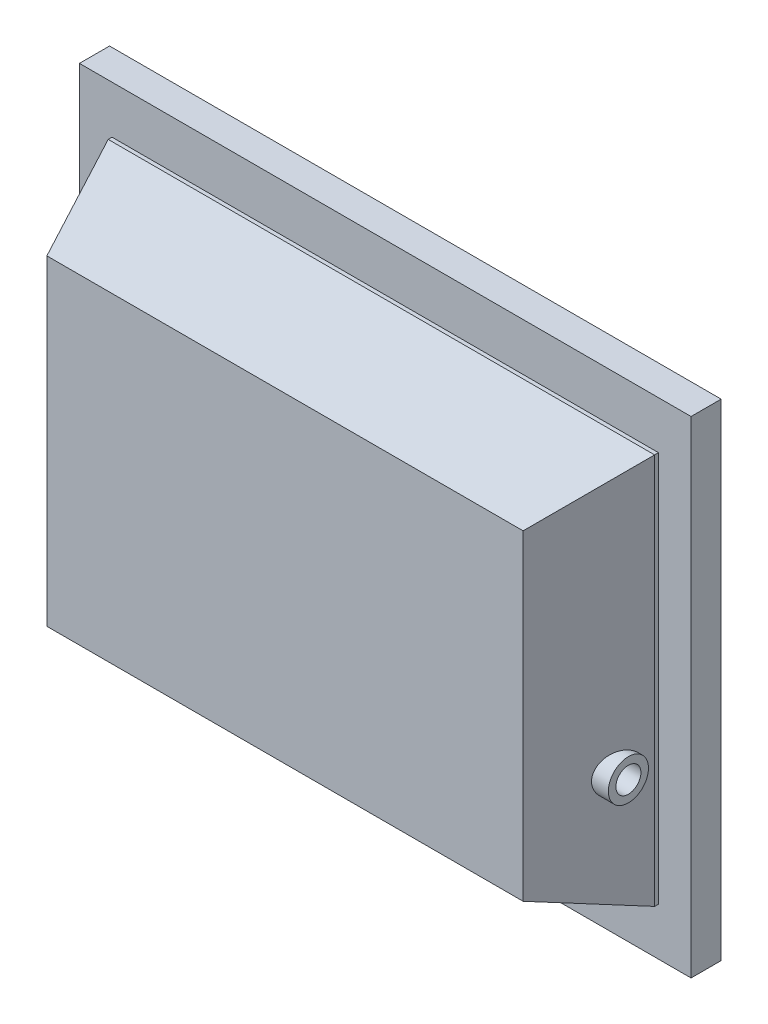
ISO-10303-21;
HEADER;
FILE_DESCRIPTION(('STEP AP214'),'2;1');
FILE_NAME('part.step','',(''),(''),'','','');
FILE_SCHEMA(('AUTOMOTIVE_DESIGN { 1 0 10303 214 1 1 1 1 }'));
ENDSEC;
DATA;
#1=APPLICATION_CONTEXT('core data for automotive mechanical design processes');
#2=APPLICATION_PROTOCOL_DEFINITION('international standard','automotive_design',2000,#1);
#3=PRODUCT_CONTEXT('',#1,'mechanical');
#4=PRODUCT('Part','Part','',(#3));
#5=PRODUCT_RELATED_PRODUCT_CATEGORY('part','',(#4));
#6=PRODUCT_DEFINITION_FORMATION('','',#4);
#7=PRODUCT_DEFINITION_CONTEXT('part definition',#1,'design');
#8=PRODUCT_DEFINITION('design','',#6,#7);
#9=PRODUCT_DEFINITION_SHAPE('','',#8);
#10=(LENGTH_UNIT() NAMED_UNIT(*) SI_UNIT(.MILLI.,.METRE.));
#11=(NAMED_UNIT(*) PLANE_ANGLE_UNIT() SI_UNIT($,.RADIAN.));
#12=(NAMED_UNIT(*) SI_UNIT($,.STERADIAN.) SOLID_ANGLE_UNIT());
#13=UNCERTAINTY_MEASURE_WITH_UNIT(LENGTH_MEASURE(1.E-05),#10,'distance_accuracy_value','');
#14=(GEOMETRIC_REPRESENTATION_CONTEXT(3) GLOBAL_UNCERTAINTY_ASSIGNED_CONTEXT((#13)) GLOBAL_UNIT_ASSIGNED_CONTEXT((#10,
#11,#12)) REPRESENTATION_CONTEXT('',''));
#15=CARTESIAN_POINT('',(0.,0.,0.));
#16=DIRECTION('',(0.,0.,1.));
#17=DIRECTION('',(1.,0.,0.));
#18=AXIS2_PLACEMENT_3D('',#15,#16,#17);
#19=CARTESIAN_POINT('',(0.,0.,6.));
#20=DIRECTION('',(0.,0.,-1.));
#21=DIRECTION('',(-1.,0.,0.));
#22=AXIS2_PLACEMENT_3D('',#19,#20,#21);
#23=PLANE('',#22);
#24=DIRECTION('',(0.,1.,0.));
#25=VECTOR('',#24,1.);
#26=CARTESIAN_POINT('',(61.,-48.5,6.));
#27=LINE('',#26,#25);
#28=CARTESIAN_POINT('',(61.,-48.5,6.));
#29=VERTEX_POINT('',#28);
#30=CARTESIAN_POINT('',(61.,48.5,6.));
#31=VERTEX_POINT('',#30);
#32=EDGE_CURVE('E229',#29,#31,#27,.T.);
#33=ORIENTED_EDGE('',*,*,#32,.T.);
#34=DIRECTION('',(-1.,0.,0.));
#35=VECTOR('',#34,1.);
#36=CARTESIAN_POINT('',(-61.,48.5,6.));
#37=LINE('',#36,#35);
#38=CARTESIAN_POINT('',(-61.,48.5,6.));
#39=VERTEX_POINT('',#38);
#40=EDGE_CURVE('E232',#31,#39,#37,.T.);
#41=ORIENTED_EDGE('',*,*,#40,.T.);
#42=DIRECTION('',(0.,-1.,0.));
#43=VECTOR('',#42,1.);
#44=CARTESIAN_POINT('',(-61.,-48.5,6.));
#45=LINE('',#44,#43);
#46=CARTESIAN_POINT('',(-61.,-48.5,6.));
#47=VERTEX_POINT('',#46);
#48=EDGE_CURVE('E235',#39,#47,#45,.T.);
#49=ORIENTED_EDGE('',*,*,#48,.T.);
#50=DIRECTION('',(1.,0.,0.));
#51=VECTOR('',#50,1.);
#52=CARTESIAN_POINT('',(-61.,-48.5,6.));
#53=LINE('',#52,#51);
#54=EDGE_CURVE('E237',#47,#29,#53,.T.);
#55=ORIENTED_EDGE('',*,*,#54,.T.);
#56=EDGE_LOOP('',(#33,#41,#49,#55));
#57=FACE_BOUND('',#56,.T.);
#58=DIRECTION('',(0.,1.,0.));
#59=VECTOR('',#58,1.);
#60=CARTESIAN_POINT('',(54.5,-39.,6.));
#61=LINE('',#60,#59);
#62=CARTESIAN_POINT('',(54.5,-39.,6.));
#63=VERTEX_POINT('',#62);
#64=CARTESIAN_POINT('',(54.5,39.,6.));
#65=VERTEX_POINT('',#64);
#66=EDGE_CURVE('E207',#63,#65,#61,.T.);
#67=ORIENTED_EDGE('',*,*,#66,.F.);
#68=DIRECTION('',(1.,0.,0.));
#69=VECTOR('',#68,1.);
#70=CARTESIAN_POINT('',(-54.5,-39.,6.));
#71=LINE('',#70,#69);
#72=CARTESIAN_POINT('',(-54.5,-39.,6.));
#73=VERTEX_POINT('',#72);
#74=EDGE_CURVE('E217',#73,#63,#71,.T.);
#75=ORIENTED_EDGE('',*,*,#74,.F.);
#76=DIRECTION('',(0.,-1.,0.));
#77=VECTOR('',#76,1.);
#78=CARTESIAN_POINT('',(-54.5,-39.,6.));
#79=LINE('',#78,#77);
#80=CARTESIAN_POINT('',(-54.5,39.,6.));
#81=VERTEX_POINT('',#80);
#82=EDGE_CURVE('E214',#81,#73,#79,.T.);
#83=ORIENTED_EDGE('',*,*,#82,.F.);
#84=DIRECTION('',(-1.,0.,0.));
#85=VECTOR('',#84,1.);
#86=CARTESIAN_POINT('',(-54.5,39.,6.));
#87=LINE('',#86,#85);
#88=EDGE_CURVE('E210',#65,#81,#87,.T.);
#89=ORIENTED_EDGE('',*,*,#88,.F.);
#90=EDGE_LOOP('',(#67,#75,#83,#89));
#91=FACE_BOUND('',#90,.T.);
#92=ADVANCED_FACE('F52',(#57,#91),#23,.F.);
#93=CARTESIAN_POINT('',(61.,-48.5,6.));
#94=DIRECTION('',(-1.,0.,0.));
#95=DIRECTION('',(0.,0.,1.));
#96=AXIS2_PLACEMENT_3D('',#93,#94,#95);
#97=PLANE('',#96);
#98=DIRECTION('',(0.,1.,0.));
#99=VECTOR('',#98,1.);
#100=CARTESIAN_POINT('',(61.,-48.5,0.));
#101=LINE('',#100,#99);
#102=CARTESIAN_POINT('',(61.,-48.5,0.));
#103=VERTEX_POINT('',#102);
#104=CARTESIAN_POINT('',(61.,48.5,0.));
#105=VERTEX_POINT('',#104);
#106=EDGE_CURVE('E228',#103,#105,#101,.T.);
#107=ORIENTED_EDGE('',*,*,#106,.T.);
#108=DIRECTION('',(0.,0.,-1.));
#109=VECTOR('',#108,1.);
#110=CARTESIAN_POINT('',(61.,48.5,6.));
#111=LINE('',#110,#109);
#112=EDGE_CURVE('E255',#31,#105,#111,.T.);
#113=ORIENTED_EDGE('',*,*,#112,.F.);
#114=ORIENTED_EDGE('',*,*,#32,.F.);
#115=DIRECTION('',(0.,0.,-1.));
#116=VECTOR('',#115,1.);
#117=CARTESIAN_POINT('',(61.,-48.5,6.));
#118=LINE('',#117,#116);
#119=EDGE_CURVE('E239',#29,#103,#118,.T.);
#120=ORIENTED_EDGE('',*,*,#119,.T.);
#121=EDGE_LOOP('',(#107,#113,#114,#120));
#122=FACE_BOUND('',#121,.T.);
#123=ADVANCED_FACE('F319',(#122),#97,.F.);
#124=CARTESIAN_POINT('',(-61.,48.5,6.));
#125=DIRECTION('',(0.,-1.,0.));
#126=DIRECTION('',(0.,0.,-1.));
#127=AXIS2_PLACEMENT_3D('',#124,#125,#126);
#128=PLANE('',#127);
#129=DIRECTION('',(-1.,0.,0.));
#130=VECTOR('',#129,1.);
#131=CARTESIAN_POINT('',(-61.,48.5,0.));
#132=LINE('',#131,#130);
#133=CARTESIAN_POINT('',(-61.,48.5,0.));
#134=VERTEX_POINT('',#133);
#135=EDGE_CURVE('E242',#105,#134,#132,.T.);
#136=ORIENTED_EDGE('',*,*,#135,.T.);
#137=DIRECTION('',(0.,0.,-1.));
#138=VECTOR('',#137,1.);
#139=CARTESIAN_POINT('',(-61.,48.5,6.));
#140=LINE('',#139,#138);
#141=EDGE_CURVE('E252',#39,#134,#140,.T.);
#142=ORIENTED_EDGE('',*,*,#141,.F.);
#143=ORIENTED_EDGE('',*,*,#40,.F.);
#144=ORIENTED_EDGE('',*,*,#112,.T.);
#145=EDGE_LOOP('',(#136,#142,#143,#144));
#146=FACE_BOUND('',#145,.T.);
#147=ADVANCED_FACE('F327',(#146),#128,.F.);
#148=CARTESIAN_POINT('',(-61.,-48.5,6.));
#149=DIRECTION('',(1.,0.,0.));
#150=DIRECTION('',(0.,0.,-1.));
#151=AXIS2_PLACEMENT_3D('',#148,#149,#150);
#152=PLANE('',#151);
#153=DIRECTION('',(0.,-1.,0.));
#154=VECTOR('',#153,1.);
#155=CARTESIAN_POINT('',(-61.,-48.5,0.));
#156=LINE('',#155,#154);
#157=CARTESIAN_POINT('',(-61.,-48.5,0.));
#158=VERTEX_POINT('',#157);
#159=EDGE_CURVE('E244',#134,#158,#156,.T.);
#160=ORIENTED_EDGE('',*,*,#159,.T.);
#161=DIRECTION('',(0.,0.,-1.));
#162=VECTOR('',#161,1.);
#163=CARTESIAN_POINT('',(-61.,-48.5,6.));
#164=LINE('',#163,#162);
#165=EDGE_CURVE('E249',#47,#158,#164,.T.);
#166=ORIENTED_EDGE('',*,*,#165,.F.);
#167=ORIENTED_EDGE('',*,*,#48,.F.);
#168=ORIENTED_EDGE('',*,*,#141,.T.);
#169=EDGE_LOOP('',(#160,#166,#167,#168));
#170=FACE_BOUND('',#169,.T.);
#171=ADVANCED_FACE('F341',(#170),#152,.F.);
#172=CARTESIAN_POINT('',(-61.,-48.5,6.));
#173=DIRECTION('',(0.,1.,0.));
#174=DIRECTION('',(0.,0.,1.));
#175=AXIS2_PLACEMENT_3D('',#172,#173,#174);
#176=PLANE('',#175);
#177=DIRECTION('',(1.,0.,0.));
#178=VECTOR('',#177,1.);
#179=CARTESIAN_POINT('',(-61.,-48.5,0.));
#180=LINE('',#179,#178);
#181=EDGE_CURVE('E233',#158,#103,#180,.T.);
#182=ORIENTED_EDGE('',*,*,#181,.T.);
#183=ORIENTED_EDGE('',*,*,#119,.F.);
#184=ORIENTED_EDGE('',*,*,#54,.F.);
#185=ORIENTED_EDGE('',*,*,#165,.T.);
#186=EDGE_LOOP('',(#182,#183,#184,#185));
#187=FACE_BOUND('',#186,.T.);
#188=ADVANCED_FACE('F338',(#187),#176,.F.);
#189=CARTESIAN_POINT('',(0.,0.,0.));
#190=DIRECTION('',(0.,0.,-1.));
#191=DIRECTION('',(-1.,0.,0.));
#192=AXIS2_PLACEMENT_3D('',#189,#190,#191);
#193=PLANE('',#192);
#194=DIRECTION('',(0.,-1.,0.));
#195=VECTOR('',#194,1.);
#196=CARTESIAN_POINT('',(46.2409304242549,34.6820960524735,0.));
#197=LINE('',#196,#195);
#198=CARTESIAN_POINT('',(46.2409304242549,34.6820960524735,0.));
#199=VERTEX_POINT('',#198);
#200=CARTESIAN_POINT('',(46.2409304242549,-34.6820960524735,0.));
#201=VERTEX_POINT('',#200);
#202=EDGE_CURVE('E69',#199,#201,#197,.T.);
#203=ORIENTED_EDGE('',*,*,#202,.F.);
#204=DIRECTION('',(1.,0.,0.));
#205=VECTOR('',#204,1.);
#206=CARTESIAN_POINT('',(-46.2409304242549,34.6820960524735,0.));
#207=LINE('',#206,#205);
#208=CARTESIAN_POINT('',(-46.2409304242549,34.6820960524735,0.));
#209=VERTEX_POINT('',#208);
#210=EDGE_CURVE('E176',#209,#199,#207,.T.);
#211=ORIENTED_EDGE('',*,*,#210,.F.);
#212=DIRECTION('',(0.,1.,0.));
#213=VECTOR('',#212,1.);
#214=CARTESIAN_POINT('',(-46.2409304242549,34.6820960524735,0.));
#215=LINE('',#214,#213);
#216=CARTESIAN_POINT('',(-46.2409304242549,-34.6820960524735,0.));
#217=VERTEX_POINT('',#216);
#218=EDGE_CURVE('E179',#217,#209,#215,.T.);
#219=ORIENTED_EDGE('',*,*,#218,.F.);
#220=DIRECTION('',(-1.,0.,0.));
#221=VECTOR('',#220,1.);
#222=CARTESIAN_POINT('',(-46.2409304242549,-34.6820960524735,0.));
#223=LINE('',#222,#221);
#224=EDGE_CURVE('E185',#201,#217,#223,.T.);
#225=ORIENTED_EDGE('',*,*,#224,.F.);
#226=EDGE_LOOP('',(#203,#211,#219,#225));
#227=FACE_BOUND('',#226,.T.);
#228=ORIENTED_EDGE('',*,*,#106,.F.);
#229=ORIENTED_EDGE('',*,*,#181,.F.);
#230=ORIENTED_EDGE('',*,*,#159,.F.);
#231=ORIENTED_EDGE('',*,*,#135,.F.);
#232=EDGE_LOOP('',(#228,#229,#230,#231));
#233=FACE_BOUND('',#232,.T.);
#234=ADVANCED_FACE('F335',(#227,#233),#193,.T.);
#235=CARTESIAN_POINT('',(54.5,-39.,26.));
#236=DIRECTION('',(-1.,0.,0.));
#237=DIRECTION('',(0.,0.,1.));
#238=AXIS2_PLACEMENT_3D('',#235,#236,#237);
#239=PLANE('',#238);
#240=DIRECTION('',(0.,0.,-1.));
#241=VECTOR('',#240,1.);
#242=CARTESIAN_POINT('',(54.5,39.,26.));
#243=LINE('',#242,#241);
#244=CARTESIAN_POINT('',(54.5,39.,6.76765806381766));
#245=VERTEX_POINT('',#244);
#246=EDGE_CURVE('E226',#245,#65,#243,.T.);
#247=ORIENTED_EDGE('',*,*,#246,.F.);
#248=DIRECTION('',(0.,-1.,0.));
#249=VECTOR('',#248,1.);
#250=CARTESIAN_POINT('',(54.5,-39.,6.76765806381766));
#251=LINE('',#250,#249);
#252=CARTESIAN_POINT('',(54.5,-39.,6.76765806381766));
#253=VERTEX_POINT('',#252);
#254=EDGE_CURVE('E270',#245,#253,#251,.T.);
#255=ORIENTED_EDGE('',*,*,#254,.T.);
#256=DIRECTION('',(0.,0.,-1.));
#257=VECTOR('',#256,1.);
#258=CARTESIAN_POINT('',(54.5,-39.,26.));
#259=LINE('',#258,#257);
#260=EDGE_CURVE('E220',#253,#63,#259,.T.);
#261=ORIENTED_EDGE('',*,*,#260,.T.);
#262=ORIENTED_EDGE('',*,*,#66,.T.);
#263=EDGE_LOOP('',(#247,#255,#261,#262));
#264=FACE_BOUND('',#263,.T.);
#265=ADVANCED_FACE('F333',(#264),#239,.F.);
#266=CARTESIAN_POINT('',(-54.5,39.,26.));
#267=DIRECTION('',(0.,-1.,0.));
#268=DIRECTION('',(0.,0.,-1.));
#269=AXIS2_PLACEMENT_3D('',#266,#267,#268);
#270=PLANE('',#269);
#271=DIRECTION('',(0.,0.,-1.));
#272=VECTOR('',#271,1.);
#273=CARTESIAN_POINT('',(-54.5,39.,26.));
#274=LINE('',#273,#272);
#275=CARTESIAN_POINT('',(-54.5,39.,6.76765806381766));
#276=VERTEX_POINT('',#275);
#277=EDGE_CURVE('E224',#276,#81,#274,.T.);
#278=ORIENTED_EDGE('',*,*,#277,.F.);
#279=DIRECTION('',(1.,0.,0.));
#280=VECTOR('',#279,1.);
#281=CARTESIAN_POINT('',(-54.5,39.,6.76765806381766));
#282=LINE('',#281,#280);
#283=EDGE_CURVE('E267',#276,#245,#282,.T.);
#284=ORIENTED_EDGE('',*,*,#283,.T.);
#285=ORIENTED_EDGE('',*,*,#246,.T.);
#286=ORIENTED_EDGE('',*,*,#88,.T.);
#287=EDGE_LOOP('',(#278,#284,#285,#286));
#288=FACE_BOUND('',#287,.T.);
#289=ADVANCED_FACE('F301',(#288),#270,.F.);
#290=CARTESIAN_POINT('',(-54.5,-39.,26.));
#291=DIRECTION('',(1.,0.,0.));
#292=DIRECTION('',(0.,0.,-1.));
#293=AXIS2_PLACEMENT_3D('',#290,#291,#292);
#294=PLANE('',#293);
#295=DIRECTION('',(0.,0.,-1.));
#296=VECTOR('',#295,1.);
#297=CARTESIAN_POINT('',(-54.5,-39.,26.));
#298=LINE('',#297,#296);
#299=CARTESIAN_POINT('',(-54.5,-39.,6.76765806381766));
#300=VERTEX_POINT('',#299);
#301=EDGE_CURVE('E222',#300,#73,#298,.T.);
#302=ORIENTED_EDGE('',*,*,#301,.F.);
#303=DIRECTION('',(0.,1.,0.));
#304=VECTOR('',#303,1.);
#305=CARTESIAN_POINT('',(-54.5,-39.,6.76765806381766));
#306=LINE('',#305,#304);
#307=EDGE_CURVE('E273',#300,#276,#306,.T.);
#308=ORIENTED_EDGE('',*,*,#307,.T.);
#309=ORIENTED_EDGE('',*,*,#277,.T.);
#310=ORIENTED_EDGE('',*,*,#82,.T.);
#311=EDGE_LOOP('',(#302,#308,#309,#310));
#312=FACE_BOUND('',#311,.T.);
#313=ADVANCED_FACE('F297',(#312),#294,.F.);
#314=CARTESIAN_POINT('',(-54.5,-39.,26.));
#315=DIRECTION('',(0.,1.,0.));
#316=DIRECTION('',(0.,0.,1.));
#317=AXIS2_PLACEMENT_3D('',#314,#315,#316);
#318=PLANE('',#317);
#319=ORIENTED_EDGE('',*,*,#260,.F.);
#320=DIRECTION('',(-1.,0.,0.));
#321=VECTOR('',#320,1.);
#322=CARTESIAN_POINT('',(-54.5,-39.,6.76765806381766));
#323=LINE('',#322,#321);
#324=EDGE_CURVE('E77',#253,#300,#323,.T.);
#325=ORIENTED_EDGE('',*,*,#324,.T.);
#326=ORIENTED_EDGE('',*,*,#301,.T.);
#327=ORIENTED_EDGE('',*,*,#74,.T.);
#328=EDGE_LOOP('',(#319,#325,#326,#327));
#329=FACE_BOUND('',#328,.T.);
#330=ADVANCED_FACE('F310',(#329),#318,.F.);
#331=CARTESIAN_POINT('',(0.,0.,26.));
#332=DIRECTION('',(0.,0.,-1.));
#333=DIRECTION('',(-1.,0.,0.));
#334=AXIS2_PLACEMENT_3D('',#331,#332,#333);
#335=PLANE('',#334);
#336=DIRECTION('',(0.,1.,0.));
#337=VECTOR('',#336,1.);
#338=CARTESIAN_POINT('',(47.5,0.,26.));
#339=LINE('',#338,#337);
#340=CARTESIAN_POINT('',(47.5,-32.,26.));
#341=VERTEX_POINT('',#340);
#342=CARTESIAN_POINT('',(47.5,32.,26.));
#343=VERTEX_POINT('',#342);
#344=EDGE_CURVE('E262',#341,#343,#339,.T.);
#345=ORIENTED_EDGE('',*,*,#344,.T.);
#346=DIRECTION('',(-1.,0.,0.));
#347=VECTOR('',#346,1.);
#348=CARTESIAN_POINT('',(0.,32.,26.));
#349=LINE('',#348,#347);
#350=CARTESIAN_POINT('',(-47.5,32.,26.));
#351=VERTEX_POINT('',#350);
#352=EDGE_CURVE('E264',#343,#351,#349,.T.);
#353=ORIENTED_EDGE('',*,*,#352,.T.);
#354=DIRECTION('',(0.,-1.,0.));
#355=VECTOR('',#354,1.);
#356=CARTESIAN_POINT('',(-47.5,0.,26.));
#357=LINE('',#356,#355);
#358=CARTESIAN_POINT('',(-47.5,-32.,26.));
#359=VERTEX_POINT('',#358);
#360=EDGE_CURVE('E258',#351,#359,#357,.T.);
#361=ORIENTED_EDGE('',*,*,#360,.T.);
#362=DIRECTION('',(1.,0.,0.));
#363=VECTOR('',#362,1.);
#364=CARTESIAN_POINT('',(0.,-32.,26.));
#365=LINE('',#364,#363);
#366=EDGE_CURVE('E260',#359,#341,#365,.T.);
#367=ORIENTED_EDGE('',*,*,#366,.T.);
#368=EDGE_LOOP('',(#345,#353,#361,#367));
#369=FACE_BOUND('',#368,.T.);
#370=ADVANCED_FACE('F308',(#369),#335,.F.);
#371=CARTESIAN_POINT('',(0.,-32.,26.));
#372=DIRECTION('',(0.,0.939692620785908,-0.34202014332567));
#373=DIRECTION('',(1.,0.,0.));
#374=AXIS2_PLACEMENT_3D('',#371,#372,#373);
#375=PLANE('',#374);
#376=DIRECTION('',(0.323615577118185,0.323615577118185,0.889126490715988));
#377=VECTOR('',#376,1.);
#378=CARTESIAN_POINT('',(-44.1487346638868,-28.6487346638868,35.2075258375719));
#379=LINE('',#378,#377);
#380=EDGE_CURVE('E278',#300,#359,#379,.T.);
#381=ORIENTED_EDGE('',*,*,#380,.F.);
#382=ORIENTED_EDGE('',*,*,#324,.F.);
#383=DIRECTION('',(-0.323615577118185,0.323615577118185,0.889126490715988));
#384=VECTOR('',#383,1.);
#385=CARTESIAN_POINT('',(42.525465516707,-27.025465516707,39.6674211651458));
#386=LINE('',#385,#384);
#387=EDGE_CURVE('E211',#341,#253,#386,.F.);
#388=ORIENTED_EDGE('',*,*,#387,.F.);
#389=ORIENTED_EDGE('',*,*,#366,.F.);
#390=EDGE_LOOP('',(#381,#382,#388,#389));
#391=FACE_BOUND('',#390,.T.);
#392=ADVANCED_FACE('F55',(#391),#375,.F.);
#393=CARTESIAN_POINT('',(47.5,0.,26.));
#394=DIRECTION('',(-0.939692620785908,0.,-0.34202014332567));
#395=DIRECTION('',(0.,1.,0.));
#396=AXIS2_PLACEMENT_3D('',#393,#394,#395);
#397=PLANE('',#396);
#398=CARTESIAN_POINT('',(52.5955832797268,-14.5,12.));
#399=DIRECTION('',(-0.939692620785908,0.,-0.34202014332567));
#400=DIRECTION('',(0.34202014332567,0.,-0.939692620785908));
#401=AXIS2_PLACEMENT_3D('',#398,#399,#400);
#402=ELLIPSE('',#401,4.25671108990365,4.);
#403=CARTESIAN_POINT('',(54.0514642167916,-14.5,8.));
#404=VERTEX_POINT('',#403);
#405=EDGE_CURVE('E11',#404,#404,#402,.F.);
#406=ORIENTED_EDGE('',*,*,#405,.F.);
#407=EDGE_LOOP('',(#406));
#408=FACE_BOUND('',#407,.T.);
#409=ORIENTED_EDGE('',*,*,#387,.T.);
#410=ORIENTED_EDGE('',*,*,#254,.F.);
#411=DIRECTION('',(-0.323615577118185,-0.323615577118185,0.889126490715988));
#412=VECTOR('',#411,1.);
#413=CARTESIAN_POINT('',(44.1487346638868,28.6487346638868,35.2075258375719));
#414=LINE('',#413,#412);
#415=EDGE_CURVE('E276',#343,#245,#414,.F.);
#416=ORIENTED_EDGE('',*,*,#415,.F.);
#417=ORIENTED_EDGE('',*,*,#344,.F.);
#418=EDGE_LOOP('',(#409,#410,#416,#417));
#419=FACE_BOUND('',#418,.T.);
#420=ADVANCED_FACE('F285',(#408,#419),#397,.F.);
#421=CARTESIAN_POINT('',(-47.5,0.,26.));
#422=DIRECTION('',(0.939692620785908,0.,-0.34202014332567));
#423=DIRECTION('',(0.,-1.,0.));
#424=AXIS2_PLACEMENT_3D('',#421,#422,#423);
#425=PLANE('',#424);
#426=CARTESIAN_POINT('',(-52.5955832797268,-14.5,12.));
#427=DIRECTION('',(0.939692620785908,0.,-0.34202014332567));
#428=DIRECTION('',(0.34202014332567,0.,0.939692620785908));
#429=AXIS2_PLACEMENT_3D('',#426,#427,#428);
#430=ELLIPSE('',#429,4.25671108990365,4.);
#431=CARTESIAN_POINT('',(-51.139702342662,-14.5,16.));
#432=VERTEX_POINT('',#431);
#433=EDGE_CURVE('E57',#432,#432,#430,.F.);
#434=ORIENTED_EDGE('',*,*,#433,.F.);
#435=EDGE_LOOP('',(#434));
#436=FACE_BOUND('',#435,.T.);
#437=ORIENTED_EDGE('',*,*,#380,.T.);
#438=ORIENTED_EDGE('',*,*,#360,.F.);
#439=DIRECTION('',(-0.323615577118185,0.323615577118185,-0.889126490715988));
#440=VECTOR('',#439,1.);
#441=CARTESIAN_POINT('',(-44.1487346638868,28.6487346638868,35.2075258375719));
#442=LINE('',#441,#440);
#443=EDGE_CURVE('E198',#276,#351,#442,.F.);
#444=ORIENTED_EDGE('',*,*,#443,.F.);
#445=ORIENTED_EDGE('',*,*,#307,.F.);
#446=EDGE_LOOP('',(#437,#438,#444,#445));
#447=FACE_BOUND('',#446,.T.);
#448=ADVANCED_FACE('F294',(#436,#447),#425,.F.);
#449=CARTESIAN_POINT('',(0.,32.,26.));
#450=DIRECTION('',(0.,-0.939692620785908,-0.34202014332567));
#451=DIRECTION('',(-1.,0.,0.));
#452=AXIS2_PLACEMENT_3D('',#449,#450,#451);
#453=PLANE('',#452);
#454=ORIENTED_EDGE('',*,*,#415,.T.);
#455=ORIENTED_EDGE('',*,*,#283,.F.);
#456=ORIENTED_EDGE('',*,*,#443,.T.);
#457=ORIENTED_EDGE('',*,*,#352,.F.);
#458=EDGE_LOOP('',(#454,#455,#456,#457));
#459=FACE_BOUND('',#458,.T.);
#460=ADVANCED_FACE('F305',(#459),#453,.F.);
#461=CARTESIAN_POINT('',(-65.8137084989848,-14.5,12.));
#462=DIRECTION('',(1.,0.,0.));
#463=DIRECTION('',(0.,0.,-1.));
#464=AXIS2_PLACEMENT_3D('',#461,#462,#463);
#465=CYLINDRICAL_SURFACE('',#464,4.);
#466=ORIENTED_EDGE('',*,*,#433,.T.);
#467=EDGE_LOOP('',(#466));
#468=FACE_BOUND('',#467,.T.);
#469=CARTESIAN_POINT('',(-54.5,-14.5,12.));
#470=DIRECTION('',(1.,0.,0.));
#471=DIRECTION('',(0.,0.,-1.));
#472=AXIS2_PLACEMENT_3D('',#469,#470,#471);
#473=CIRCLE('',#472,4.);
#474=CARTESIAN_POINT('',(-54.5,-14.5,8.));
#475=VERTEX_POINT('',#474);
#476=EDGE_CURVE('E195',#475,#475,#473,.F.);
#477=ORIENTED_EDGE('',*,*,#476,.F.);
#478=EDGE_LOOP('',(#477));
#479=FACE_BOUND('',#478,.T.);
#480=ADVANCED_FACE('F355',(#468,#479),#465,.T.);
#481=CARTESIAN_POINT('',(-54.5,-39.,26.));
#482=DIRECTION('',(1.,0.,0.));
#483=DIRECTION('',(0.,0.,-1.));
#484=AXIS2_PLACEMENT_3D('',#481,#482,#483);
#485=PLANE('',#484);
#486=ORIENTED_EDGE('',*,*,#476,.T.);
#487=EDGE_LOOP('',(#486));
#488=FACE_BOUND('',#487,.T.);
#489=CARTESIAN_POINT('',(-54.5,-14.5,12.));
#490=DIRECTION('',(1.,0.,0.));
#491=DIRECTION('',(0.,0.,-1.));
#492=AXIS2_PLACEMENT_3D('',#489,#490,#491);
#493=CIRCLE('',#492,2.5);
#494=CARTESIAN_POINT('',(-54.5,-14.5,9.5));
#495=VERTEX_POINT('',#494);
#496=EDGE_CURVE('E199',#495,#495,#493,.F.);
#497=ORIENTED_EDGE('',*,*,#496,.F.);
#498=EDGE_LOOP('',(#497));
#499=FACE_BOUND('',#498,.T.);
#500=ADVANCED_FACE('F373',(#488,#499),#485,.F.);
#501=ORIENTED_EDGE('',*,*,#405,.T.);
#502=EDGE_LOOP('',(#501));
#503=FACE_BOUND('',#502,.T.);
#504=CARTESIAN_POINT('',(54.5,-14.5,12.));
#505=DIRECTION('',(1.,0.,0.));
#506=DIRECTION('',(0.,0.,-1.));
#507=AXIS2_PLACEMENT_3D('',#504,#505,#506);
#508=CIRCLE('',#507,4.);
#509=CARTESIAN_POINT('',(54.5,-14.5,8.));
#510=VERTEX_POINT('',#509);
#511=EDGE_CURVE('E202',#510,#510,#508,.T.);
#512=ORIENTED_EDGE('',*,*,#511,.F.);
#513=EDGE_LOOP('',(#512));
#514=FACE_BOUND('',#513,.T.);
#515=ADVANCED_FACE('F369',(#503,#514),#465,.T.);
#516=CARTESIAN_POINT('',(54.5,-14.5,12.));
#517=DIRECTION('',(1.,0.,0.));
#518=DIRECTION('',(0.,0.,-1.));
#519=AXIS2_PLACEMENT_3D('',#516,#517,#518);
#520=PLANE('',#519);
#521=CARTESIAN_POINT('',(54.5,-14.5,12.));
#522=DIRECTION('',(1.,0.,0.));
#523=DIRECTION('',(0.,0.,-1.));
#524=AXIS2_PLACEMENT_3D('',#521,#522,#523);
#525=CIRCLE('',#524,2.5);
#526=CARTESIAN_POINT('',(54.5,-14.5,9.5));
#527=VERTEX_POINT('',#526);
#528=EDGE_CURVE('E191',#527,#527,#525,.T.);
#529=ORIENTED_EDGE('',*,*,#528,.F.);
#530=EDGE_LOOP('',(#529));
#531=FACE_BOUND('',#530,.T.);
#532=ORIENTED_EDGE('',*,*,#511,.T.);
#533=EDGE_LOOP('',(#532));
#534=FACE_BOUND('',#533,.T.);
#535=ADVANCED_FACE('F372',(#531,#534),#520,.T.);
#536=CARTESIAN_POINT('',(-61.001,-14.5,12.));
#537=DIRECTION('',(1.,0.,0.));
#538=DIRECTION('',(0.,0.,-1.));
#539=AXIS2_PLACEMENT_3D('',#536,#537,#538);
#540=CYLINDRICAL_SURFACE('',#539,2.5);
#541=ORIENTED_EDGE('',*,*,#496,.T.);
#542=EDGE_LOOP('',(#541));
#543=FACE_BOUND('',#542,.T.);
#544=ORIENTED_EDGE('',*,*,#528,.T.);
#545=EDGE_LOOP('',(#544));
#546=FACE_BOUND('',#545,.T.);
#547=ADVANCED_FACE('F378',(#543,#546),#540,.F.);
#548=CARTESIAN_POINT('',(46.2409304242549,34.6820960524735,1.));
#549=DIRECTION('',(1.,0.,0.));
#550=DIRECTION('',(0.,0.,-1.));
#551=AXIS2_PLACEMENT_3D('',#548,#549,#550);
#552=PLANE('',#551);
#553=ORIENTED_EDGE('',*,*,#202,.T.);
#554=DIRECTION('',(0.,0.,-1.));
#555=VECTOR('',#554,1.);
#556=CARTESIAN_POINT('',(46.2409304242549,-34.6820960524735,1.));
#557=LINE('',#556,#555);
#558=CARTESIAN_POINT('',(46.2409304242549,-34.6820960524735,1.));
#559=VERTEX_POINT('',#558);
#560=EDGE_CURVE('E154',#559,#201,#557,.T.);
#561=ORIENTED_EDGE('',*,*,#560,.F.);
#562=DIRECTION('',(0.,-1.,0.));
#563=VECTOR('',#562,1.);
#564=CARTESIAN_POINT('',(46.2409304242549,34.6820960524735,1.));
#565=LINE('',#564,#563);
#566=CARTESIAN_POINT('',(46.2409304242549,34.6820960524735,1.));
#567=VERTEX_POINT('',#566);
#568=EDGE_CURVE('E158',#567,#559,#565,.T.);
#569=ORIENTED_EDGE('',*,*,#568,.F.);
#570=DIRECTION('',(0.,0.,-1.));
#571=VECTOR('',#570,1.);
#572=CARTESIAN_POINT('',(46.2409304242549,34.6820960524735,1.));
#573=LINE('',#572,#571);
#574=EDGE_CURVE('E189',#567,#199,#573,.T.);
#575=ORIENTED_EDGE('',*,*,#574,.T.);
#576=EDGE_LOOP('',(#553,#561,#569,#575));
#577=FACE_BOUND('',#576,.T.);
#578=ADVANCED_FACE('F156',(#577),#552,.F.);
#579=CARTESIAN_POINT('',(-46.2409304242549,34.6820960524735,1.));
#580=DIRECTION('',(0.,1.,0.));
#581=DIRECTION('',(0.,0.,1.));
#582=AXIS2_PLACEMENT_3D('',#579,#580,#581);
#583=PLANE('',#582);
#584=ORIENTED_EDGE('',*,*,#210,.T.);
#585=ORIENTED_EDGE('',*,*,#574,.F.);
#586=DIRECTION('',(1.,0.,0.));
#587=VECTOR('',#586,1.);
#588=CARTESIAN_POINT('',(-46.2409304242549,34.6820960524735,1.));
#589=LINE('',#588,#587);
#590=CARTESIAN_POINT('',(-46.2409304242549,34.6820960524735,1.));
#591=VERTEX_POINT('',#590);
#592=EDGE_CURVE('E164',#591,#567,#589,.T.);
#593=ORIENTED_EDGE('',*,*,#592,.F.);
#594=DIRECTION('',(0.,0.,-1.));
#595=VECTOR('',#594,1.);
#596=CARTESIAN_POINT('',(-46.2409304242549,34.6820960524735,1.));
#597=LINE('',#596,#595);
#598=EDGE_CURVE('E192',#591,#209,#597,.T.);
#599=ORIENTED_EDGE('',*,*,#598,.T.);
#600=EDGE_LOOP('',(#584,#585,#593,#599));
#601=FACE_BOUND('',#600,.T.);
#602=ADVANCED_FACE('F432',(#601),#583,.F.);
#603=CARTESIAN_POINT('',(-46.2409304242549,34.6820960524735,1.));
#604=DIRECTION('',(-1.,0.,0.));
#605=DIRECTION('',(0.,0.,1.));
#606=AXIS2_PLACEMENT_3D('',#603,#604,#605);
#607=PLANE('',#606);
#608=ORIENTED_EDGE('',*,*,#218,.T.);
#609=ORIENTED_EDGE('',*,*,#598,.F.);
#610=DIRECTION('',(0.,1.,0.));
#611=VECTOR('',#610,1.);
#612=CARTESIAN_POINT('',(-46.2409304242549,34.6820960524735,1.));
#613=LINE('',#612,#611);
#614=CARTESIAN_POINT('',(-46.2409304242549,-34.6820960524735,1.));
#615=VERTEX_POINT('',#614);
#616=EDGE_CURVE('E172',#615,#591,#613,.T.);
#617=ORIENTED_EDGE('',*,*,#616,.F.);
#618=DIRECTION('',(0.,0.,-1.));
#619=VECTOR('',#618,1.);
#620=CARTESIAN_POINT('',(-46.2409304242549,-34.6820960524735,1.));
#621=LINE('',#620,#619);
#622=EDGE_CURVE('E163',#615,#217,#621,.T.);
#623=ORIENTED_EDGE('',*,*,#622,.T.);
#624=EDGE_LOOP('',(#608,#609,#617,#623));
#625=FACE_BOUND('',#624,.T.);
#626=ADVANCED_FACE('F442',(#625),#607,.F.);
#627=CARTESIAN_POINT('',(-46.2409304242549,-34.6820960524735,1.));
#628=DIRECTION('',(0.,-1.,0.));
#629=DIRECTION('',(0.,0.,-1.));
#630=AXIS2_PLACEMENT_3D('',#627,#628,#629);
#631=PLANE('',#630);
#632=ORIENTED_EDGE('',*,*,#224,.T.);
#633=ORIENTED_EDGE('',*,*,#622,.F.);
#634=DIRECTION('',(-1.,0.,0.));
#635=VECTOR('',#634,1.);
#636=CARTESIAN_POINT('',(-46.2409304242549,-34.6820960524735,1.));
#637=LINE('',#636,#635);
#638=EDGE_CURVE('E167',#559,#615,#637,.T.);
#639=ORIENTED_EDGE('',*,*,#638,.F.);
#640=ORIENTED_EDGE('',*,*,#560,.T.);
#641=EDGE_LOOP('',(#632,#633,#639,#640));
#642=FACE_BOUND('',#641,.T.);
#643=ADVANCED_FACE('F168',(#642),#631,.F.);
#644=CARTESIAN_POINT('',(0.,0.,1.));
#645=DIRECTION('',(0.,0.,1.));
#646=DIRECTION('',(1.,0.,0.));
#647=AXIS2_PLACEMENT_3D('',#644,#645,#646);
#648=PLANE('',#647);
#649=ORIENTED_EDGE('',*,*,#568,.T.);
#650=ORIENTED_EDGE('',*,*,#638,.T.);
#651=ORIENTED_EDGE('',*,*,#616,.T.);
#652=ORIENTED_EDGE('',*,*,#592,.T.);
#653=EDGE_LOOP('',(#649,#650,#651,#652));
#654=FACE_BOUND('',#653,.T.);
#655=ADVANCED_FACE('F174',(#654),#648,.F.);
#656=CLOSED_SHELL('',(#92,#123,#147,#171,#188,#234,#265,#289,#313,#330,#370,#392,#420,#448,#460,
#480,#500,#515,#535,#547,#578,#602,#626,#643,#655));
#657=MANIFOLD_SOLID_BREP('B2',#656);
#658=ADVANCED_BREP_SHAPE_REPRESENTATION('',(#18,#657),#14);
#659=SHAPE_DEFINITION_REPRESENTATION(#9,#658);
ENDSEC;
END-ISO-10303-21;
